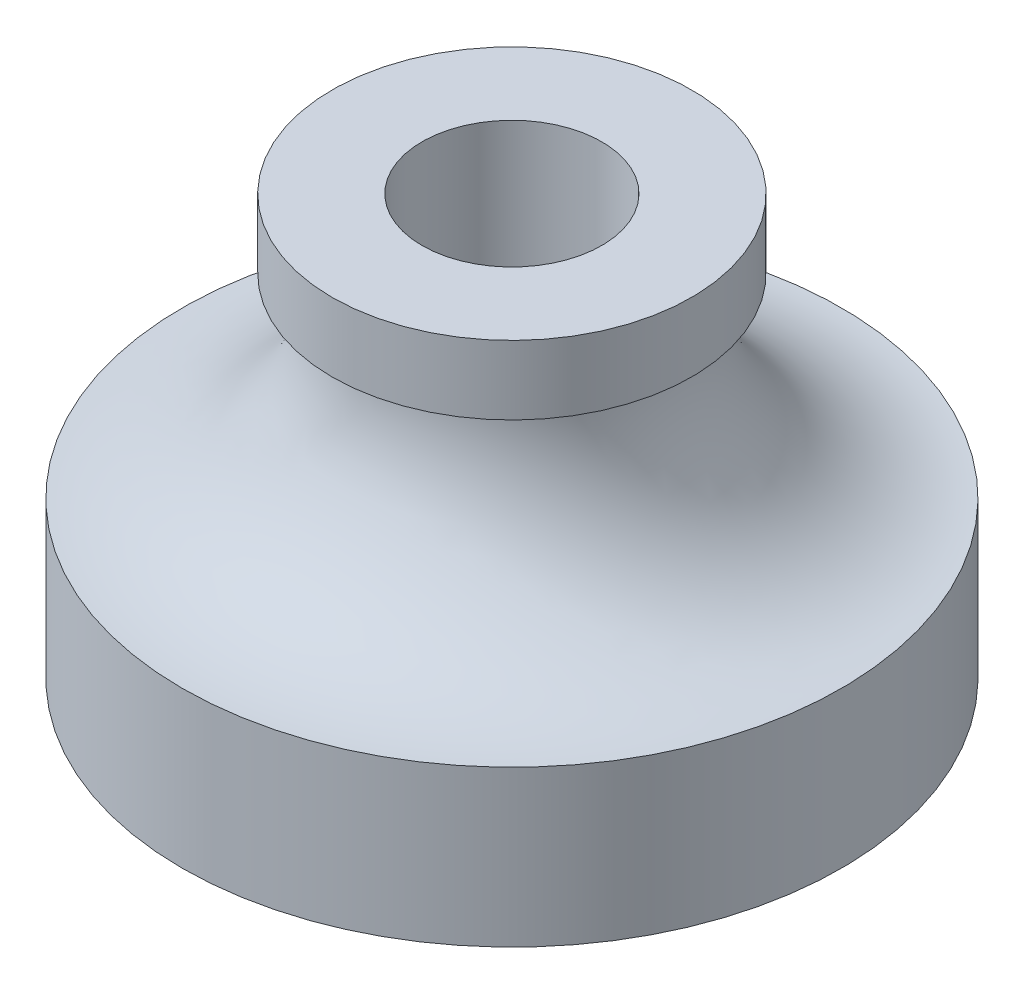
ISO-10303-21;
HEADER;
FILE_DESCRIPTION(('STEP AP214'),'2;1');
FILE_NAME('part.step','',(''),(''),'','','');
FILE_SCHEMA(('AUTOMOTIVE_DESIGN { 1 0 10303 214 1 1 1 1 }'));
ENDSEC;
DATA;
#1=APPLICATION_CONTEXT('core data for automotive mechanical design processes');
#2=APPLICATION_PROTOCOL_DEFINITION('international standard','automotive_design',2000,#1);
#3=PRODUCT_CONTEXT('',#1,'mechanical');
#4=PRODUCT('Part','Part','',(#3));
#5=PRODUCT_RELATED_PRODUCT_CATEGORY('part','',(#4));
#6=PRODUCT_DEFINITION_FORMATION('','',#4);
#7=PRODUCT_DEFINITION_CONTEXT('part definition',#1,'design');
#8=PRODUCT_DEFINITION('design','',#6,#7);
#9=PRODUCT_DEFINITION_SHAPE('','',#8);
#10=(LENGTH_UNIT() NAMED_UNIT(*) SI_UNIT(.MILLI.,.METRE.));
#11=(NAMED_UNIT(*) PLANE_ANGLE_UNIT() SI_UNIT($,.RADIAN.));
#12=(NAMED_UNIT(*) SI_UNIT($,.STERADIAN.) SOLID_ANGLE_UNIT());
#13=UNCERTAINTY_MEASURE_WITH_UNIT(LENGTH_MEASURE(1.E-05),#10,'distance_accuracy_value','');
#14=(GEOMETRIC_REPRESENTATION_CONTEXT(3) GLOBAL_UNCERTAINTY_ASSIGNED_CONTEXT((#13)) GLOBAL_UNIT_ASSIGNED_CONTEXT((#10,
#11,#12)) REPRESENTATION_CONTEXT('',''));
#15=CARTESIAN_POINT('',(0.,0.,0.));
#16=DIRECTION('',(0.,0.,1.));
#17=DIRECTION('',(1.,0.,0.));
#18=AXIS2_PLACEMENT_3D('',#15,#16,#17);
#19=CARTESIAN_POINT('',(0.,7.,0.));
#20=DIRECTION('',(0.,1.,0.));
#21=DIRECTION('',(0.,0.,1.));
#22=AXIS2_PLACEMENT_3D('',#19,#20,#21);
#23=PLANE('',#22);
#24=CARTESIAN_POINT('',(0.,7.,0.));
#25=DIRECTION('',(0.,1.,0.));
#26=DIRECTION('',(0.,0.,1.));
#27=AXIS2_PLACEMENT_3D('',#24,#25,#26);
#28=CIRCLE('',#27,1.5);
#29=CARTESIAN_POINT('',(0.,7.,1.5));
#30=VERTEX_POINT('',#29);
#31=EDGE_CURVE('E22',#30,#30,#28,.T.);
#32=ORIENTED_EDGE('',*,*,#31,.F.);
#33=EDGE_LOOP('',(#32));
#34=FACE_BOUND('',#33,.T.);
#35=CARTESIAN_POINT('',(0.,7.,0.));
#36=DIRECTION('',(0.,1.,0.));
#37=DIRECTION('',(0.,0.,1.));
#38=AXIS2_PLACEMENT_3D('',#35,#36,#37);
#39=CIRCLE('',#38,3.);
#40=CARTESIAN_POINT('',(0.,7.,3.));
#41=VERTEX_POINT('',#40);
#42=EDGE_CURVE('E41',#41,#41,#39,.T.);
#43=ORIENTED_EDGE('',*,*,#42,.T.);
#44=EDGE_LOOP('',(#43));
#45=FACE_BOUND('',#44,.T.);
#46=ADVANCED_FACE('F15',(#34,#45),#23,.T.);
#47=CARTESIAN_POINT('',(0.,0.,0.));
#48=DIRECTION('',(0.,1.,0.));
#49=DIRECTION('',(0.,0.,1.));
#50=AXIS2_PLACEMENT_3D('',#47,#48,#49);
#51=PLANE('',#50);
#52=CARTESIAN_POINT('',(0.,0.,0.));
#53=DIRECTION('',(0.,1.,0.));
#54=DIRECTION('',(0.,0.,1.));
#55=AXIS2_PLACEMENT_3D('',#52,#53,#54);
#56=CIRCLE('',#55,5.5);
#57=CARTESIAN_POINT('',(0.,0.,5.5));
#58=VERTEX_POINT('',#57);
#59=EDGE_CURVE('E10',#58,#58,#56,.T.);
#60=ORIENTED_EDGE('',*,*,#59,.F.);
#61=EDGE_LOOP('',(#60));
#62=FACE_BOUND('',#61,.T.);
#63=CARTESIAN_POINT('',(0.,0.,0.));
#64=DIRECTION('',(0.,1.,0.));
#65=DIRECTION('',(0.,0.,1.));
#66=AXIS2_PLACEMENT_3D('',#63,#64,#65);
#67=CIRCLE('',#66,1.5);
#68=CARTESIAN_POINT('',(0.,0.,1.5));
#69=VERTEX_POINT('',#68);
#70=EDGE_CURVE('E26',#69,#69,#67,.T.);
#71=ORIENTED_EDGE('',*,*,#70,.T.);
#72=EDGE_LOOP('',(#71));
#73=FACE_BOUND('',#72,.T.);
#74=ADVANCED_FACE('F66',(#62,#73),#51,.F.);
#75=CARTESIAN_POINT('',(0.,7.,0.));
#76=DIRECTION('',(0.,-1.,0.));
#77=DIRECTION('',(0.,0.,-1.));
#78=AXIS2_PLACEMENT_3D('',#75,#76,#77);
#79=CYLINDRICAL_SURFACE('',#78,5.5);
#80=CARTESIAN_POINT('',(0.,2.6,0.));
#81=DIRECTION('',(0.,1.,0.));
#82=DIRECTION('',(0.,0.,1.));
#83=AXIS2_PLACEMENT_3D('',#80,#81,#82);
#84=CIRCLE('',#83,5.5);
#85=CARTESIAN_POINT('',(0.,2.6,5.5));
#86=VERTEX_POINT('',#85);
#87=EDGE_CURVE('E31',#86,#86,#84,.T.);
#88=ORIENTED_EDGE('',*,*,#87,.F.);
#89=EDGE_LOOP('',(#88));
#90=FACE_BOUND('',#89,.T.);
#91=ORIENTED_EDGE('',*,*,#59,.T.);
#92=EDGE_LOOP('',(#91));
#93=FACE_BOUND('',#92,.T.);
#94=ADVANCED_FACE('F17',(#90,#93),#79,.T.);
#95=CARTESIAN_POINT('',(0.,7.,0.));
#96=DIRECTION('',(0.,-1.,0.));
#97=DIRECTION('',(0.,0.,-1.));
#98=AXIS2_PLACEMENT_3D('',#95,#96,#97);
#99=CYLINDRICAL_SURFACE('',#98,1.5);
#100=ORIENTED_EDGE('',*,*,#31,.T.);
#101=EDGE_LOOP('',(#100));
#102=FACE_BOUND('',#101,.T.);
#103=ORIENTED_EDGE('',*,*,#70,.F.);
#104=EDGE_LOOP('',(#103));
#105=FACE_BOUND('',#104,.T.);
#106=ADVANCED_FACE('F61',(#102,#105),#99,.F.);
#107=CARTESIAN_POINT('',(0.,5.60958634646201,0.));
#108=DIRECTION('',(0.,1.,0.));
#109=DIRECTION('',(0.,0.,1.));
#110=AXIS2_PLACEMENT_3D('',#107,#108,#109);
#111=TOROIDAL_SURFACE('',#110,5.5,3.009586346462);
#112=CARTESIAN_POINT('',(0.,5.84960713058397,0.));
#113=DIRECTION('',(0.,1.,0.));
#114=DIRECTION('',(0.,0.,1.));
#115=AXIS2_PLACEMENT_3D('',#112,#113,#114);
#116=CIRCLE('',#115,2.5);
#117=CARTESIAN_POINT('',(0.,5.84960713058397,2.5));
#118=VERTEX_POINT('',#117);
#119=EDGE_CURVE('E35',#118,#118,#116,.T.);
#120=ORIENTED_EDGE('',*,*,#119,.F.);
#121=EDGE_LOOP('',(#120));
#122=FACE_BOUND('',#121,.T.);
#123=ORIENTED_EDGE('',*,*,#87,.T.);
#124=EDGE_LOOP('',(#123));
#125=FACE_BOUND('',#124,.T.);
#126=ADVANCED_FACE('F55',(#122,#125),#111,.F.);
#127=CARTESIAN_POINT('',(-3.,5.84960713058397,0.));
#128=DIRECTION('',(0.,1.,0.));
#129=DIRECTION('',(0.,0.,1.));
#130=AXIS2_PLACEMENT_3D('',#127,#128,#129);
#131=PLANE('',#130);
#132=CARTESIAN_POINT('',(0.,5.84960713058397,0.));
#133=DIRECTION('',(0.,1.,0.));
#134=DIRECTION('',(0.,0.,1.));
#135=AXIS2_PLACEMENT_3D('',#132,#133,#134);
#136=CIRCLE('',#135,3.);
#137=CARTESIAN_POINT('',(0.,5.84960713058397,3.));
#138=VERTEX_POINT('',#137);
#139=EDGE_CURVE('E38',#138,#138,#136,.T.);
#140=ORIENTED_EDGE('',*,*,#139,.F.);
#141=EDGE_LOOP('',(#140));
#142=FACE_BOUND('',#141,.T.);
#143=ORIENTED_EDGE('',*,*,#119,.T.);
#144=EDGE_LOOP('',(#143));
#145=FACE_BOUND('',#144,.T.);
#146=ADVANCED_FACE('F49',(#142,#145),#131,.F.);
#147=CARTESIAN_POINT('',(0.,9.68485181009771,0.));
#148=DIRECTION('',(0.,1.,0.));
#149=DIRECTION('',(0.,0.,1.));
#150=AXIS2_PLACEMENT_3D('',#147,#148,#149);
#151=CYLINDRICAL_SURFACE('',#150,3.);
#152=ORIENTED_EDGE('',*,*,#42,.F.);
#153=EDGE_LOOP('',(#152));
#154=FACE_BOUND('',#153,.T.);
#155=ORIENTED_EDGE('',*,*,#139,.T.);
#156=EDGE_LOOP('',(#155));
#157=FACE_BOUND('',#156,.T.);
#158=ADVANCED_FACE('F46',(#154,#157),#151,.T.);
#159=CLOSED_SHELL('',(#46,#74,#94,#106,#126,#146,#158));
#160=MANIFOLD_SOLID_BREP('B1',#159);
#161=ADVANCED_BREP_SHAPE_REPRESENTATION('',(#18,#160),#14);
#162=SHAPE_DEFINITION_REPRESENTATION(#9,#161);
ENDSEC;
END-ISO-10303-21;
